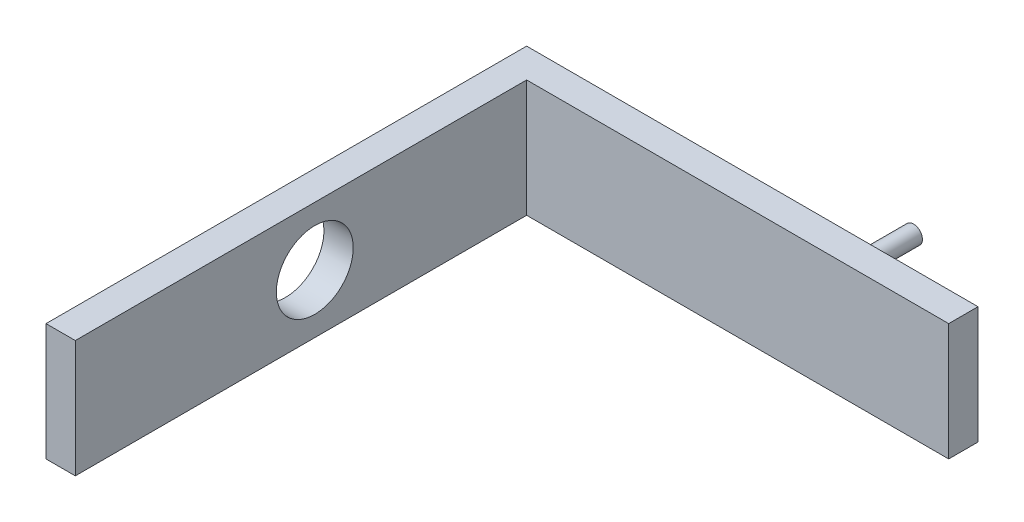
ISO-10303-21;
HEADER;
FILE_DESCRIPTION(('STEP AP214'),'2;1');
FILE_NAME('part.step','',(''),(''),'','','');
FILE_SCHEMA(('AUTOMOTIVE_DESIGN { 1 0 10303 214 1 1 1 1 }'));
ENDSEC;
DATA;
#1=APPLICATION_CONTEXT('core data for automotive mechanical design processes');
#2=APPLICATION_PROTOCOL_DEFINITION('international standard','automotive_design',2000,#1);
#3=PRODUCT_CONTEXT('',#1,'mechanical');
#4=PRODUCT('Part','Part','',(#3));
#5=PRODUCT_RELATED_PRODUCT_CATEGORY('part','',(#4));
#6=PRODUCT_DEFINITION_FORMATION('','',#4);
#7=PRODUCT_DEFINITION_CONTEXT('part definition',#1,'design');
#8=PRODUCT_DEFINITION('design','',#6,#7);
#9=PRODUCT_DEFINITION_SHAPE('','',#8);
#10=(LENGTH_UNIT() NAMED_UNIT(*) SI_UNIT(.MILLI.,.METRE.));
#11=(NAMED_UNIT(*) PLANE_ANGLE_UNIT() SI_UNIT($,.RADIAN.));
#12=(NAMED_UNIT(*) SI_UNIT($,.STERADIAN.) SOLID_ANGLE_UNIT());
#13=UNCERTAINTY_MEASURE_WITH_UNIT(LENGTH_MEASURE(1.E-05),#10,'distance_accuracy_value','');
#14=(GEOMETRIC_REPRESENTATION_CONTEXT(3) GLOBAL_UNCERTAINTY_ASSIGNED_CONTEXT((#13)) GLOBAL_UNIT_ASSIGNED_CONTEXT((#10,
#11,#12)) REPRESENTATION_CONTEXT('',''));
#15=CARTESIAN_POINT('',(0.,0.,0.));
#16=DIRECTION('',(0.,0.,1.));
#17=DIRECTION('',(1.,0.,0.));
#18=AXIS2_PLACEMENT_3D('',#15,#16,#17);
#19=CARTESIAN_POINT('',(-2.75770809575521,7.9375,-45.2264127703854));
#20=DIRECTION('',(0.,0.,1.));
#21=DIRECTION('',(1.,0.,0.));
#22=AXIS2_PLACEMENT_3D('',#19,#20,#21);
#23=PLANE('',#22);
#24=CARTESIAN_POINT('',(37.5647919042448,0.,-45.2264127703854));
#25=DIRECTION('',(0.,0.,1.));
#26=DIRECTION('',(1.,0.,0.));
#27=AXIS2_PLACEMENT_3D('',#24,#25,#26);
#28=CIRCLE('',#27,1.2065);
#29=CARTESIAN_POINT('',(38.7712919042448,0.,-45.2264127703854));
#30=VERTEX_POINT('',#29);
#31=EDGE_CURVE('E11',#30,#30,#28,.F.);
#32=ORIENTED_EDGE('',*,*,#31,.F.);
#33=EDGE_LOOP('',(#32));
#34=FACE_BOUND('',#33,.T.);
#35=DIRECTION('',(-1.,0.,0.));
#36=VECTOR('',#35,1.);
#37=CARTESIAN_POINT('',(-2.75770809575521,-7.9375,-45.2264127703854));
#38=LINE('',#37,#36);
#39=CARTESIAN_POINT('',(58.3610419042448,-7.9375,-45.2264127703854));
#40=VERTEX_POINT('',#39);
#41=CARTESIAN_POINT('',(-2.75770809575521,-7.9375,-45.2264127703854));
#42=VERTEX_POINT('',#41);
#43=EDGE_CURVE('E82',#40,#42,#38,.T.);
#44=ORIENTED_EDGE('',*,*,#43,.T.);
#45=DIRECTION('',(0.,-1.,0.));
#46=VECTOR('',#45,1.);
#47=CARTESIAN_POINT('',(-2.75770809575521,7.9375,-45.2264127703854));
#48=LINE('',#47,#46);
#49=CARTESIAN_POINT('',(-2.75770809575521,7.9375,-45.2264127703854));
#50=VERTEX_POINT('',#49);
#51=EDGE_CURVE('E44',#50,#42,#48,.T.);
#52=ORIENTED_EDGE('',*,*,#51,.F.);
#53=DIRECTION('',(-1.,0.,0.));
#54=VECTOR('',#53,1.);
#55=CARTESIAN_POINT('',(6.27967860958227,7.9375,-45.2264127703854));
#56=LINE('',#55,#54);
#57=CARTESIAN_POINT('',(58.3610419042448,7.9375,-45.2264127703854));
#58=VERTEX_POINT('',#57);
#59=EDGE_CURVE('E88',#58,#50,#56,.T.);
#60=ORIENTED_EDGE('',*,*,#59,.F.);
#61=DIRECTION('',(0.,-1.,0.));
#62=VECTOR('',#61,1.);
#63=CARTESIAN_POINT('',(58.3610419042448,7.9375,-45.2264127703854));
#64=LINE('',#63,#62);
#65=EDGE_CURVE('E116',#58,#40,#64,.T.);
#66=ORIENTED_EDGE('',*,*,#65,.T.);
#67=EDGE_LOOP('',(#44,#52,#60,#66));
#68=FACE_BOUND('',#67,.T.);
#69=ADVANCED_FACE('F36',(#34,#68),#23,.F.);
#70=CARTESIAN_POINT('',(-2.75770809575521,7.9375,19.8610872296146));
#71=DIRECTION('',(1.,0.,0.));
#72=DIRECTION('',(0.,0.,-1.));
#73=AXIS2_PLACEMENT_3D('',#70,#71,#72);
#74=PLANE('',#73);
#75=CARTESIAN_POINT('',(-2.75770809575521,0.,-12.5665598417181));
#76=DIRECTION('',(-1.,0.,0.));
#77=DIRECTION('',(0.,0.,1.));
#78=AXIS2_PLACEMENT_3D('',#75,#76,#77);
#79=CIRCLE('',#78,5.207);
#80=CARTESIAN_POINT('',(-2.75770809575521,0.,-7.35955984171809));
#81=VERTEX_POINT('',#80);
#82=EDGE_CURVE('E152',#81,#81,#79,.T.);
#83=ORIENTED_EDGE('',*,*,#82,.F.);
#84=EDGE_LOOP('',(#83));
#85=FACE_BOUND('',#84,.T.);
#86=DIRECTION('',(0.,0.,1.));
#87=VECTOR('',#86,1.);
#88=CARTESIAN_POINT('',(-2.75770809575521,-7.9375,19.8610872296146));
#89=LINE('',#88,#87);
#90=CARTESIAN_POINT('',(-2.75770809575521,-7.9375,19.8610872296146));
#91=VERTEX_POINT('',#90);
#92=EDGE_CURVE('E121',#42,#91,#89,.T.);
#93=ORIENTED_EDGE('',*,*,#92,.T.);
#94=DIRECTION('',(0.,-1.,0.));
#95=VECTOR('',#94,1.);
#96=CARTESIAN_POINT('',(-2.75770809575521,7.9375,19.8610872296146));
#97=LINE('',#96,#95);
#98=CARTESIAN_POINT('',(-2.75770809575521,7.9375,19.8610872296146));
#99=VERTEX_POINT('',#98);
#100=EDGE_CURVE('E134',#99,#91,#97,.T.);
#101=ORIENTED_EDGE('',*,*,#100,.F.);
#102=DIRECTION('',(0.,0.,1.));
#103=VECTOR('',#102,1.);
#104=CARTESIAN_POINT('',(-2.75770809575521,7.9375,19.8610872296146));
#105=LINE('',#104,#103);
#106=EDGE_CURVE('E141',#50,#99,#105,.T.);
#107=ORIENTED_EDGE('',*,*,#106,.F.);
#108=ORIENTED_EDGE('',*,*,#51,.T.);
#109=EDGE_LOOP('',(#93,#101,#107,#108));
#110=FACE_BOUND('',#109,.T.);
#111=ADVANCED_FACE('F139',(#85,#110),#74,.F.);
#112=CARTESIAN_POINT('',(-2.75770809575521,7.9375,19.8610872296146));
#113=DIRECTION('',(0.,0.,-1.));
#114=DIRECTION('',(-1.,0.,0.));
#115=AXIS2_PLACEMENT_3D('',#112,#113,#114);
#116=PLANE('',#115);
#117=DIRECTION('',(1.,0.,0.));
#118=VECTOR('',#117,1.);
#119=CARTESIAN_POINT('',(-2.75770809575521,-7.9375,19.8610872296146));
#120=LINE('',#119,#118);
#121=CARTESIAN_POINT('',(1.21104190424479,-7.9375,19.8610872296146));
#122=VERTEX_POINT('',#121);
#123=EDGE_CURVE('E124',#91,#122,#120,.T.);
#124=ORIENTED_EDGE('',*,*,#123,.T.);
#125=DIRECTION('',(0.,-1.,0.));
#126=VECTOR('',#125,1.);
#127=CARTESIAN_POINT('',(1.21104190424479,7.9375,19.8610872296146));
#128=LINE('',#127,#126);
#129=CARTESIAN_POINT('',(1.21104190424479,7.9375,19.8610872296146));
#130=VERTEX_POINT('',#129);
#131=EDGE_CURVE('E111',#130,#122,#128,.T.);
#132=ORIENTED_EDGE('',*,*,#131,.F.);
#133=DIRECTION('',(1.,0.,0.));
#134=VECTOR('',#133,1.);
#135=CARTESIAN_POINT('',(-2.75770809575521,7.9375,19.8610872296146));
#136=LINE('',#135,#134);
#137=EDGE_CURVE('E102',#99,#130,#136,.T.);
#138=ORIENTED_EDGE('',*,*,#137,.F.);
#139=ORIENTED_EDGE('',*,*,#100,.T.);
#140=EDGE_LOOP('',(#124,#132,#138,#139));
#141=FACE_BOUND('',#140,.T.);
#142=ADVANCED_FACE('F146',(#141),#116,.F.);
#143=CARTESIAN_POINT('',(1.21104190424479,7.9375,19.8610872296146));
#144=DIRECTION('',(-1.,0.,0.));
#145=DIRECTION('',(0.,0.,1.));
#146=AXIS2_PLACEMENT_3D('',#143,#144,#145);
#147=PLANE('',#146);
#148=CARTESIAN_POINT('',(1.21104190424479,0.,-12.5665598417181));
#149=DIRECTION('',(-1.,0.,0.));
#150=DIRECTION('',(0.,0.,1.));
#151=AXIS2_PLACEMENT_3D('',#148,#149,#150);
#152=CIRCLE('',#151,5.207);
#153=CARTESIAN_POINT('',(1.21104190424479,0.,-7.35955984171809));
#154=VERTEX_POINT('',#153);
#155=EDGE_CURVE('E122',#154,#154,#152,.F.);
#156=ORIENTED_EDGE('',*,*,#155,.F.);
#157=EDGE_LOOP('',(#156));
#158=FACE_BOUND('',#157,.T.);
#159=DIRECTION('',(0.,0.,-1.));
#160=VECTOR('',#159,1.);
#161=CARTESIAN_POINT('',(1.21104190424479,-7.9375,19.8610872296146));
#162=LINE('',#161,#160);
#163=CARTESIAN_POINT('',(1.21104190424479,-7.9375,-41.2576627703854));
#164=VERTEX_POINT('',#163);
#165=EDGE_CURVE('E110',#122,#164,#162,.T.);
#166=ORIENTED_EDGE('',*,*,#165,.T.);
#167=DIRECTION('',(0.,-1.,0.));
#168=VECTOR('',#167,1.);
#169=CARTESIAN_POINT('',(1.21104190424479,7.9375,-41.2576627703854));
#170=LINE('',#169,#168);
#171=CARTESIAN_POINT('',(1.21104190424479,7.9375,-41.2576627703854));
#172=VERTEX_POINT('',#171);
#173=EDGE_CURVE('E107',#172,#164,#170,.T.);
#174=ORIENTED_EDGE('',*,*,#173,.F.);
#175=DIRECTION('',(0.,0.,-1.));
#176=VECTOR('',#175,1.);
#177=CARTESIAN_POINT('',(1.21104190424479,7.9375,19.8610872296146));
#178=LINE('',#177,#176);
#179=EDGE_CURVE('E96',#130,#172,#178,.T.);
#180=ORIENTED_EDGE('',*,*,#179,.F.);
#181=ORIENTED_EDGE('',*,*,#131,.T.);
#182=EDGE_LOOP('',(#166,#174,#180,#181));
#183=FACE_BOUND('',#182,.T.);
#184=ADVANCED_FACE('F108',(#158,#183),#147,.F.);
#185=CARTESIAN_POINT('',(1.21104190424479,7.9375,-41.2576627703854));
#186=DIRECTION('',(0.,0.,-1.));
#187=DIRECTION('',(-1.,0.,0.));
#188=AXIS2_PLACEMENT_3D('',#185,#186,#187);
#189=PLANE('',#188);
#190=DIRECTION('',(1.,0.,0.));
#191=VECTOR('',#190,1.);
#192=CARTESIAN_POINT('',(1.21104190424479,-7.9375,-41.2576627703854));
#193=LINE('',#192,#191);
#194=CARTESIAN_POINT('',(58.3610419042448,-7.9375,-41.2576627703854));
#195=VERTEX_POINT('',#194);
#196=EDGE_CURVE('E75',#164,#195,#193,.T.);
#197=ORIENTED_EDGE('',*,*,#196,.T.);
#198=DIRECTION('',(0.,-1.,0.));
#199=VECTOR('',#198,1.);
#200=CARTESIAN_POINT('',(58.3610419042448,7.9375,-41.2576627703854));
#201=LINE('',#200,#199);
#202=CARTESIAN_POINT('',(58.3610419042448,7.9375,-41.2576627703854));
#203=VERTEX_POINT('',#202);
#204=EDGE_CURVE('E112',#203,#195,#201,.T.);
#205=ORIENTED_EDGE('',*,*,#204,.F.);
#206=DIRECTION('',(1.,0.,0.));
#207=VECTOR('',#206,1.);
#208=CARTESIAN_POINT('',(1.21104190424479,7.9375,-41.2576627703854));
#209=LINE('',#208,#207);
#210=EDGE_CURVE('E100',#172,#203,#209,.T.);
#211=ORIENTED_EDGE('',*,*,#210,.F.);
#212=ORIENTED_EDGE('',*,*,#173,.T.);
#213=EDGE_LOOP('',(#197,#205,#211,#212));
#214=FACE_BOUND('',#213,.T.);
#215=ADVANCED_FACE('F114',(#214),#189,.F.);
#216=CARTESIAN_POINT('',(58.3610419042448,7.9375,-45.2264127703854));
#217=DIRECTION('',(-1.,0.,0.));
#218=DIRECTION('',(0.,0.,1.));
#219=AXIS2_PLACEMENT_3D('',#216,#217,#218);
#220=PLANE('',#219);
#221=DIRECTION('',(0.,0.,-1.));
#222=VECTOR('',#221,1.);
#223=CARTESIAN_POINT('',(58.3610419042448,-7.9375,-45.2264127703854));
#224=LINE('',#223,#222);
#225=EDGE_CURVE('E128',#195,#40,#224,.T.);
#226=ORIENTED_EDGE('',*,*,#225,.T.);
#227=ORIENTED_EDGE('',*,*,#65,.F.);
#228=DIRECTION('',(0.,0.,-1.));
#229=VECTOR('',#228,1.);
#230=CARTESIAN_POINT('',(58.3610419042448,7.9375,-45.2264127703854));
#231=LINE('',#230,#229);
#232=EDGE_CURVE('E52',#203,#58,#231,.T.);
#233=ORIENTED_EDGE('',*,*,#232,.F.);
#234=ORIENTED_EDGE('',*,*,#204,.T.);
#235=EDGE_LOOP('',(#226,#227,#233,#234));
#236=FACE_BOUND('',#235,.T.);
#237=ADVANCED_FACE('F170',(#236),#220,.F.);
#238=CARTESIAN_POINT('',(0.,7.9375,0.));
#239=DIRECTION('',(0.,-1.,0.));
#240=DIRECTION('',(0.,0.,-1.));
#241=AXIS2_PLACEMENT_3D('',#238,#239,#240);
#242=PLANE('',#241);
#243=ORIENTED_EDGE('',*,*,#59,.T.);
#244=ORIENTED_EDGE('',*,*,#106,.T.);
#245=ORIENTED_EDGE('',*,*,#137,.T.);
#246=ORIENTED_EDGE('',*,*,#179,.T.);
#247=ORIENTED_EDGE('',*,*,#210,.T.);
#248=ORIENTED_EDGE('',*,*,#232,.T.);
#249=EDGE_LOOP('',(#243,#244,#245,#246,#247,#248));
#250=FACE_BOUND('',#249,.T.);
#251=ADVANCED_FACE('F98',(#250),#242,.F.);
#252=CARTESIAN_POINT('',(0.,-7.9375,0.));
#253=DIRECTION('',(0.,-1.,0.));
#254=DIRECTION('',(0.,0.,-1.));
#255=AXIS2_PLACEMENT_3D('',#252,#253,#254);
#256=PLANE('',#255);
#257=ORIENTED_EDGE('',*,*,#43,.F.);
#258=ORIENTED_EDGE('',*,*,#225,.F.);
#259=ORIENTED_EDGE('',*,*,#196,.F.);
#260=ORIENTED_EDGE('',*,*,#165,.F.);
#261=ORIENTED_EDGE('',*,*,#123,.F.);
#262=ORIENTED_EDGE('',*,*,#92,.F.);
#263=EDGE_LOOP('',(#257,#258,#259,#260,#261,#262));
#264=FACE_BOUND('',#263,.T.);
#265=ADVANCED_FACE('F144',(#264),#256,.T.);
#266=CARTESIAN_POINT('',(15.9386619427982,0.,-12.5665598417181));
#267=DIRECTION('',(-1.,0.,0.));
#268=DIRECTION('',(0.,0.,1.));
#269=AXIS2_PLACEMENT_3D('',#266,#267,#268);
#270=CYLINDRICAL_SURFACE('',#269,5.207);
#271=ORIENTED_EDGE('',*,*,#155,.T.);
#272=EDGE_LOOP('',(#271));
#273=FACE_BOUND('',#272,.T.);
#274=ORIENTED_EDGE('',*,*,#82,.T.);
#275=EDGE_LOOP('',(#274));
#276=FACE_BOUND('',#275,.T.);
#277=ADVANCED_FACE('F164',(#273,#276),#270,.F.);
#278=CARTESIAN_POINT('',(37.5647919042448,0.,-57.2914127703854));
#279=DIRECTION('',(0.,0.,1.));
#280=DIRECTION('',(1.,0.,0.));
#281=AXIS2_PLACEMENT_3D('',#278,#279,#280);
#282=CYLINDRICAL_SURFACE('',#281,1.2065);
#283=CARTESIAN_POINT('',(37.5647919042448,0.,-57.2914127703854));
#284=DIRECTION('',(0.,0.,-1.));
#285=DIRECTION('',(-1.,0.,0.));
#286=AXIS2_PLACEMENT_3D('',#283,#284,#285);
#287=CIRCLE('',#286,1.2065);
#288=CARTESIAN_POINT('',(38.7712919042448,0.,-57.2914127703854));
#289=VERTEX_POINT('',#288);
#290=EDGE_CURVE('E155',#289,#289,#287,.T.);
#291=CARTESIAN_POINT('',(38.7712919042448,0.,-57.2914127703854));
#292=CARTESIAN_POINT('',(38.7712919042448,0.,-57.1657356870521));
#293=CARTESIAN_POINT('',(38.7712919042448,0.,-57.0400586037187));
#294=CARTESIAN_POINT('',(38.7712919042448,0.,-56.7887044370521));
#295=CARTESIAN_POINT('',(38.7712919042448,0.,-56.6630273537187));
#296=CARTESIAN_POINT('',(38.7712919042448,0.,-56.4116731870521));
#297=CARTESIAN_POINT('',(38.7712919042448,0.,-56.2859961037187));
#298=CARTESIAN_POINT('',(38.7712919042448,0.,-56.0346419370521));
#299=CARTESIAN_POINT('',(38.7712919042448,0.,-55.9089648537187));
#300=CARTESIAN_POINT('',(38.7712919042448,0.,-55.6576106870521));
#301=CARTESIAN_POINT('',(38.7712919042448,0.,-55.5319336037187));
#302=CARTESIAN_POINT('',(38.7712919042448,0.,-55.2805794370521));
#303=CARTESIAN_POINT('',(38.7712919042448,0.,-55.1549023537187));
#304=CARTESIAN_POINT('',(38.7712919042448,0.,-54.9035481870521));
#305=CARTESIAN_POINT('',(38.7712919042448,0.,-54.7778711037187));
#306=CARTESIAN_POINT('',(38.7712919042448,0.,-54.5265169370521));
#307=CARTESIAN_POINT('',(38.7712919042448,0.,-54.4008398537187));
#308=CARTESIAN_POINT('',(38.7712919042448,0.,-54.1494856870521));
#309=CARTESIAN_POINT('',(38.7712919042448,0.,-54.0238086037187));
#310=CARTESIAN_POINT('',(38.7712919042448,0.,-53.7724544370521));
#311=CARTESIAN_POINT('',(38.7712919042448,0.,-53.6467773537187));
#312=CARTESIAN_POINT('',(38.7712919042448,0.,-53.3954231870521));
#313=CARTESIAN_POINT('',(38.7712919042448,0.,-53.2697461037187));
#314=CARTESIAN_POINT('',(38.7712919042448,0.,-53.0183919370521));
#315=CARTESIAN_POINT('',(38.7712919042448,0.,-52.8927148537187));
#316=CARTESIAN_POINT('',(38.7712919042448,0.,-52.6413606870521));
#317=CARTESIAN_POINT('',(38.7712919042448,0.,-52.5156836037187));
#318=CARTESIAN_POINT('',(38.7712919042448,0.,-52.2643294370521));
#319=CARTESIAN_POINT('',(38.7712919042448,0.,-52.1386523537187));
#320=CARTESIAN_POINT('',(38.7712919042448,0.,-51.8872981870521));
#321=CARTESIAN_POINT('',(38.7712919042448,0.,-51.7616211037187));
#322=CARTESIAN_POINT('',(38.7712919042448,0.,-51.5102669370521));
#323=CARTESIAN_POINT('',(38.7712919042448,0.,-51.3845898537187));
#324=CARTESIAN_POINT('',(38.7712919042448,0.,-51.1332356870521));
#325=CARTESIAN_POINT('',(38.7712919042448,0.,-51.0075586037187));
#326=CARTESIAN_POINT('',(38.7712919042448,0.,-50.7562044370521));
#327=CARTESIAN_POINT('',(38.7712919042448,0.,-50.6305273537187));
#328=CARTESIAN_POINT('',(38.7712919042448,0.,-50.3791731870521));
#329=CARTESIAN_POINT('',(38.7712919042448,0.,-50.2534961037187));
#330=CARTESIAN_POINT('',(38.7712919042448,0.,-50.0021419370521));
#331=CARTESIAN_POINT('',(38.7712919042448,0.,-49.8764648537187));
#332=CARTESIAN_POINT('',(38.7712919042448,0.,-49.6251106870521));
#333=CARTESIAN_POINT('',(38.7712919042448,0.,-49.4994336037187));
#334=CARTESIAN_POINT('',(38.7712919042448,0.,-49.2480794370521));
#335=CARTESIAN_POINT('',(38.7712919042448,0.,-49.1224023537187));
#336=CARTESIAN_POINT('',(38.7712919042448,0.,-48.8710481870521));
#337=CARTESIAN_POINT('',(38.7712919042448,0.,-48.7453711037187));
#338=CARTESIAN_POINT('',(38.7712919042448,0.,-48.4940169370521));
#339=CARTESIAN_POINT('',(38.7712919042448,0.,-48.3683398537187));
#340=CARTESIAN_POINT('',(38.7712919042448,0.,-48.1169856870521));
#341=CARTESIAN_POINT('',(38.7712919042448,0.,-47.9913086037187));
#342=CARTESIAN_POINT('',(38.7712919042448,0.,-47.7399544370521));
#343=CARTESIAN_POINT('',(38.7712919042448,0.,-47.6142773537187));
#344=CARTESIAN_POINT('',(38.7712919042448,0.,-47.3629231870521));
#345=CARTESIAN_POINT('',(38.7712919042448,0.,-47.2372461037187));
#346=CARTESIAN_POINT('',(38.7712919042448,0.,-46.9858919370521));
#347=CARTESIAN_POINT('',(38.7712919042448,0.,-46.8602148537187));
#348=CARTESIAN_POINT('',(38.7712919042448,0.,-46.6088606870521));
#349=CARTESIAN_POINT('',(38.7712919042448,0.,-46.4831836037187));
#350=CARTESIAN_POINT('',(38.7712919042448,0.,-46.2318294370521));
#351=CARTESIAN_POINT('',(38.7712919042448,0.,-46.1061523537187));
#352=CARTESIAN_POINT('',(38.7712919042448,0.,-45.8547981870521));
#353=CARTESIAN_POINT('',(38.7712919042448,0.,-45.7291211037187));
#354=CARTESIAN_POINT('',(38.7712919042448,0.,-45.4777669370521));
#355=CARTESIAN_POINT('',(38.7712919042448,0.,-45.3520898537187));
#356=CARTESIAN_POINT('',(38.7712919042448,0.,-45.2264127703854));
#357=B_SPLINE_CURVE_WITH_KNOTS('',3,(#291,#292,#293,#294,#295,#296,#297,#298,#299,#300,#301,
#302,#303,#304,#305,#306,#307,#308,#309,#310,#311,#312,#313,#314,#315,#316,#317,#318,#319,#320,
#321,#322,#323,#324,#325,#326,#327,#328,#329,#330,#331,#332,#333,#334,#335,#336,#337,#338,#339,
#340,#341,#342,#343,#344,#345,#346,#347,#348,#349,#350,#351,#352,#353,#354,#355,#356),
.UNSPECIFIED.,.F.,.F.,(4,2,2,2,2,2,2,2,2,2,2,2,2,2,2,2,2,2,2,2,2,2,2,2,2,2,2,2,2,2,2,2,4),(0.,
0.377031250000007,0.754062500000007,1.13109375000001,1.50812500000001,1.88515625000001,
2.26218750000001,2.63921875000001,3.01625000000001,3.39328125,3.7703125,4.14734375,4.524375,
4.90140625,5.2784375,5.65546875,6.0325,6.40953125,6.7865625,7.16359375,7.540625,7.91765625,
8.29468749999999,8.67171875,9.04875,9.42578125,9.8028125,10.17984375,10.556875,10.93390625,
11.3109375,11.68796875,12.065),.UNSPECIFIED.);
#358=EDGE_CURVE('BSEAM161',#289,#30,#357,.T.);
#359=ORIENTED_EDGE('',*,*,#290,.F.);
#360=ORIENTED_EDGE('',*,*,#31,.T.);
#361=ORIENTED_EDGE('',*,*,#358,.T.);
#362=ORIENTED_EDGE('',*,*,#358,.F.);
#363=EDGE_LOOP('',(#359,#361,#360,#362));
#364=FACE_BOUND('',#363,.T.);
#365=ADVANCED_FACE('F161',(#364),#282,.T.);
#366=CARTESIAN_POINT('',(37.5647919042448,0.,-57.2914127703854));
#367=DIRECTION('',(0.,0.,-1.));
#368=DIRECTION('',(-1.,0.,0.));
#369=AXIS2_PLACEMENT_3D('',#366,#367,#368);
#370=PLANE('',#369);
#371=ORIENTED_EDGE('',*,*,#290,.T.);
#372=EDGE_LOOP('',(#371));
#373=FACE_BOUND('',#372,.T.);
#374=ADVANCED_FACE('F159',(#373),#370,.T.);
#375=CLOSED_SHELL('',(#69,#111,#142,#184,#215,#237,#251,#265,#277,#365,#374));
#376=MANIFOLD_SOLID_BREP('B2',#375);
#377=ADVANCED_BREP_SHAPE_REPRESENTATION('',(#18,#376),#14);
#378=SHAPE_DEFINITION_REPRESENTATION(#9,#377);
ENDSEC;
END-ISO-10303-21;
